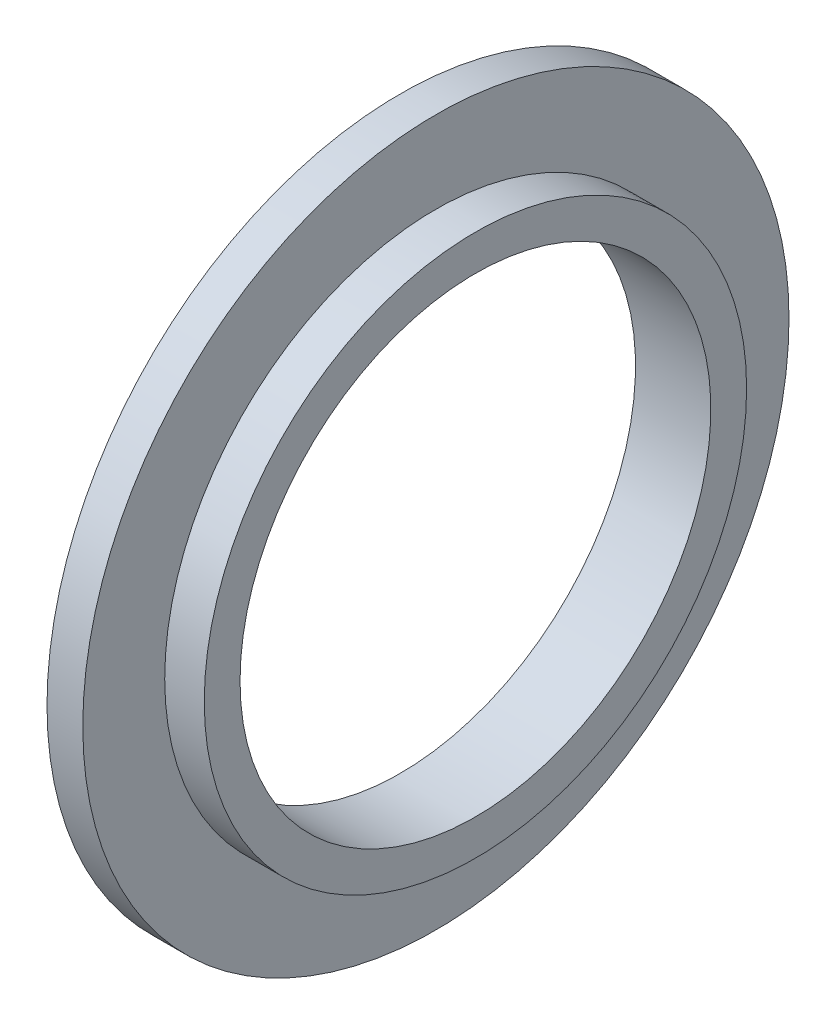
ISO-10303-21;
HEADER;
FILE_DESCRIPTION(('STEP AP214'),'2;1');
FILE_NAME('part.step','',(''),(''),'','','');
FILE_SCHEMA(('AUTOMOTIVE_DESIGN { 1 0 10303 214 1 1 1 1 }'));
ENDSEC;
DATA;
#1=APPLICATION_CONTEXT('core data for automotive mechanical design processes');
#2=APPLICATION_PROTOCOL_DEFINITION('international standard','automotive_design',2000,#1);
#3=PRODUCT_CONTEXT('',#1,'mechanical');
#4=PRODUCT('Part','Part','',(#3));
#5=PRODUCT_RELATED_PRODUCT_CATEGORY('part','',(#4));
#6=PRODUCT_DEFINITION_FORMATION('','',#4);
#7=PRODUCT_DEFINITION_CONTEXT('part definition',#1,'design');
#8=PRODUCT_DEFINITION('design','',#6,#7);
#9=PRODUCT_DEFINITION_SHAPE('','',#8);
#10=(LENGTH_UNIT() NAMED_UNIT(*) SI_UNIT(.MILLI.,.METRE.));
#11=(NAMED_UNIT(*) PLANE_ANGLE_UNIT() SI_UNIT($,.RADIAN.));
#12=(NAMED_UNIT(*) SI_UNIT($,.STERADIAN.) SOLID_ANGLE_UNIT());
#13=UNCERTAINTY_MEASURE_WITH_UNIT(LENGTH_MEASURE(1.E-05),#10,'distance_accuracy_value','');
#14=(GEOMETRIC_REPRESENTATION_CONTEXT(3) GLOBAL_UNCERTAINTY_ASSIGNED_CONTEXT((#13)) GLOBAL_UNIT_ASSIGNED_CONTEXT((#10,
#11,#12)) REPRESENTATION_CONTEXT('',''));
#15=CARTESIAN_POINT('',(0.,0.,0.));
#16=DIRECTION('',(0.,0.,1.));
#17=DIRECTION('',(1.,0.,0.));
#18=AXIS2_PLACEMENT_3D('',#15,#16,#17);
#19=CARTESIAN_POINT('',(-20.,0.,0.));
#20=DIRECTION('',(-1.,0.,0.));
#21=DIRECTION('',(0.,0.,1.));
#22=AXIS2_PLACEMENT_3D('',#19,#20,#21);
#23=CYLINDRICAL_SURFACE('',#22,25.);
#24=CARTESIAN_POINT('',(8.,0.,0.));
#25=DIRECTION('',(-1.,0.,0.));
#26=DIRECTION('',(0.,0.,1.));
#27=AXIS2_PLACEMENT_3D('',#24,#25,#26);
#28=CIRCLE('',#27,25.);
#29=CARTESIAN_POINT('',(8.,0.,25.));
#30=VERTEX_POINT('',#29);
#31=EDGE_CURVE('E10',#30,#30,#28,.T.);
#32=ORIENTED_EDGE('',*,*,#31,.F.);
#33=EDGE_LOOP('',(#32));
#34=FACE_BOUND('',#33,.T.);
#35=CARTESIAN_POINT('',(0.,0.,0.));
#36=DIRECTION('',(-1.,0.,0.));
#37=DIRECTION('',(0.,0.,1.));
#38=AXIS2_PLACEMENT_3D('',#35,#36,#37);
#39=CIRCLE('',#38,25.);
#40=CARTESIAN_POINT('',(0.,0.,25.));
#41=VERTEX_POINT('',#40);
#42=EDGE_CURVE('E53',#41,#41,#39,.T.);
#43=ORIENTED_EDGE('',*,*,#42,.T.);
#44=EDGE_LOOP('',(#43));
#45=FACE_BOUND('',#44,.T.);
#46=ADVANCED_FACE('F31',(#34,#45),#23,.F.);
#47=CARTESIAN_POINT('',(8.,28.8,0.));
#48=DIRECTION('',(1.,0.,0.));
#49=DIRECTION('',(0.,0.,-1.));
#50=AXIS2_PLACEMENT_3D('',#47,#48,#49);
#51=PLANE('',#50);
#52=ORIENTED_EDGE('',*,*,#31,.T.);
#53=EDGE_LOOP('',(#52));
#54=FACE_BOUND('',#53,.T.);
#55=CARTESIAN_POINT('',(8.,0.,0.));
#56=DIRECTION('',(-1.,0.,0.));
#57=DIRECTION('',(0.,0.,1.));
#58=AXIS2_PLACEMENT_3D('',#55,#56,#57);
#59=CIRCLE('',#58,28.8);
#60=CARTESIAN_POINT('',(8.,0.,28.8));
#61=VERTEX_POINT('',#60);
#62=EDGE_CURVE('E37',#61,#61,#59,.T.);
#63=ORIENTED_EDGE('',*,*,#62,.F.);
#64=EDGE_LOOP('',(#63));
#65=FACE_BOUND('',#64,.T.);
#66=ADVANCED_FACE('F76',(#54,#65),#51,.T.);
#67=CARTESIAN_POINT('',(-20.,0.,0.));
#68=DIRECTION('',(-1.,0.,0.));
#69=DIRECTION('',(0.,0.,1.));
#70=AXIS2_PLACEMENT_3D('',#67,#68,#69);
#71=CYLINDRICAL_SURFACE('',#70,28.8);
#72=ORIENTED_EDGE('',*,*,#62,.T.);
#73=EDGE_LOOP('',(#72));
#74=FACE_BOUND('',#73,.T.);
#75=CARTESIAN_POINT('',(3.8,0.,0.));
#76=DIRECTION('',(-1.,0.,0.));
#77=DIRECTION('',(0.,0.,1.));
#78=AXIS2_PLACEMENT_3D('',#75,#76,#77);
#79=CIRCLE('',#78,28.8);
#80=CARTESIAN_POINT('',(3.8,0.,28.8));
#81=VERTEX_POINT('',#80);
#82=EDGE_CURVE('E41',#81,#81,#79,.T.);
#83=ORIENTED_EDGE('',*,*,#82,.F.);
#84=EDGE_LOOP('',(#83));
#85=FACE_BOUND('',#84,.T.);
#86=ADVANCED_FACE('F72',(#74,#85),#71,.T.);
#87=CARTESIAN_POINT('',(3.8,25.,0.));
#88=DIRECTION('',(1.,0.,0.));
#89=DIRECTION('',(0.,0.,-1.));
#90=AXIS2_PLACEMENT_3D('',#87,#88,#89);
#91=PLANE('',#90);
#92=ORIENTED_EDGE('',*,*,#82,.T.);
#93=EDGE_LOOP('',(#92));
#94=FACE_BOUND('',#93,.T.);
#95=CARTESIAN_POINT('',(3.8,0.,0.));
#96=DIRECTION('',(-1.,0.,0.));
#97=DIRECTION('',(0.,0.,1.));
#98=AXIS2_PLACEMENT_3D('',#95,#96,#97);
#99=CIRCLE('',#98,37.5);
#100=CARTESIAN_POINT('',(3.8,0.,37.5));
#101=VERTEX_POINT('',#100);
#102=EDGE_CURVE('E45',#101,#101,#99,.T.);
#103=ORIENTED_EDGE('',*,*,#102,.F.);
#104=EDGE_LOOP('',(#103));
#105=FACE_BOUND('',#104,.T.);
#106=ADVANCED_FACE('F66',(#94,#105),#91,.T.);
#107=CARTESIAN_POINT('',(-20.,0.,0.));
#108=DIRECTION('',(-1.,0.,0.));
#109=DIRECTION('',(0.,0.,1.));
#110=AXIS2_PLACEMENT_3D('',#107,#108,#109);
#111=CYLINDRICAL_SURFACE('',#110,37.5);
#112=ORIENTED_EDGE('',*,*,#102,.T.);
#113=EDGE_LOOP('',(#112));
#114=FACE_BOUND('',#113,.T.);
#115=CARTESIAN_POINT('',(0.,0.,0.));
#116=DIRECTION('',(-1.,0.,0.));
#117=DIRECTION('',(0.,0.,1.));
#118=AXIS2_PLACEMENT_3D('',#115,#116,#117);
#119=CIRCLE('',#118,37.5);
#120=CARTESIAN_POINT('',(0.,0.,37.5));
#121=VERTEX_POINT('',#120);
#122=EDGE_CURVE('E50',#121,#121,#119,.T.);
#123=ORIENTED_EDGE('',*,*,#122,.F.);
#124=EDGE_LOOP('',(#123));
#125=FACE_BOUND('',#124,.T.);
#126=ADVANCED_FACE('F61',(#114,#125),#111,.T.);
#127=CARTESIAN_POINT('',(0.,25.,0.));
#128=DIRECTION('',(1.,0.,0.));
#129=DIRECTION('',(0.,0.,-1.));
#130=AXIS2_PLACEMENT_3D('',#127,#128,#129);
#131=PLANE('',#130);
#132=ORIENTED_EDGE('',*,*,#42,.F.);
#133=EDGE_LOOP('',(#132));
#134=FACE_BOUND('',#133,.T.);
#135=ORIENTED_EDGE('',*,*,#122,.T.);
#136=EDGE_LOOP('',(#135));
#137=FACE_BOUND('',#136,.T.);
#138=ADVANCED_FACE('F58',(#134,#137),#131,.F.);
#139=CLOSED_SHELL('',(#46,#66,#86,#106,#126,#138));
#140=MANIFOLD_SOLID_BREP('B2',#139);
#141=ADVANCED_BREP_SHAPE_REPRESENTATION('',(#18,#140),#14);
#142=SHAPE_DEFINITION_REPRESENTATION(#9,#141);
ENDSEC;
END-ISO-10303-21;
